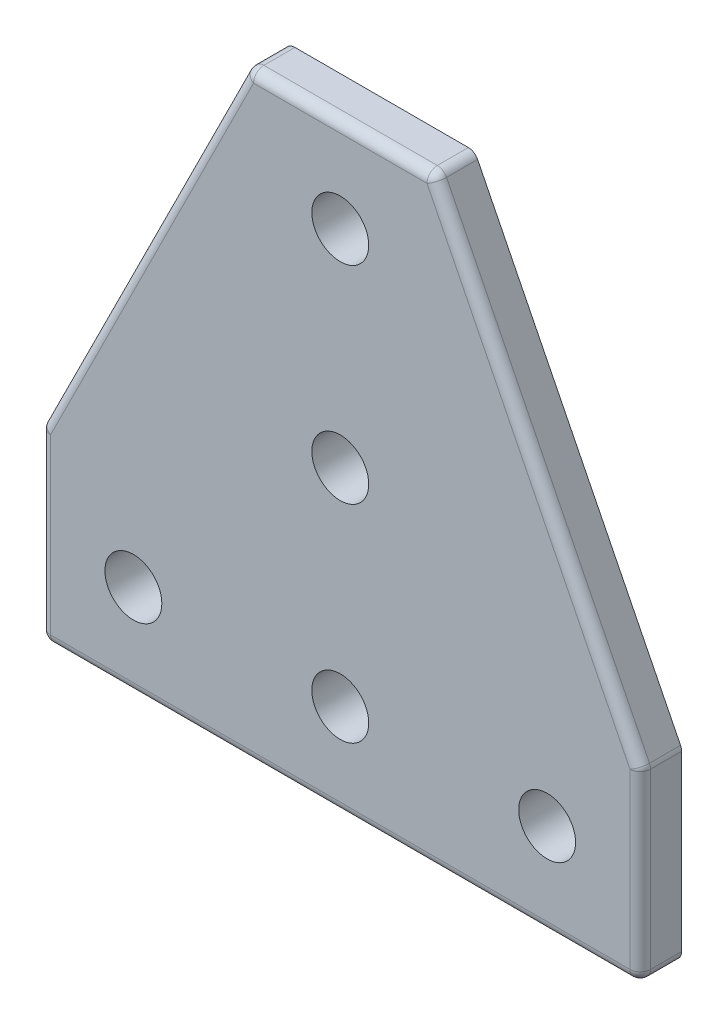
ISO-10303-21;
HEADER;
FILE_DESCRIPTION(('STEP AP214'),'2;1');
FILE_NAME('part.step','',(''),(''),'','','');
FILE_SCHEMA(('AUTOMOTIVE_DESIGN { 1 0 10303 214 1 1 1 1 }'));
ENDSEC;
DATA;
#1=APPLICATION_CONTEXT('core data for automotive mechanical design processes');
#2=APPLICATION_PROTOCOL_DEFINITION('international standard','automotive_design',2000,#1);
#3=PRODUCT_CONTEXT('',#1,'mechanical');
#4=PRODUCT('Part','Part','',(#3));
#5=PRODUCT_RELATED_PRODUCT_CATEGORY('part','',(#4));
#6=PRODUCT_DEFINITION_FORMATION('','',#4);
#7=PRODUCT_DEFINITION_CONTEXT('part definition',#1,'design');
#8=PRODUCT_DEFINITION('design','',#6,#7);
#9=PRODUCT_DEFINITION_SHAPE('','',#8);
#10=(LENGTH_UNIT() NAMED_UNIT(*) SI_UNIT(.MILLI.,.METRE.));
#11=(NAMED_UNIT(*) PLANE_ANGLE_UNIT() SI_UNIT($,.RADIAN.));
#12=(NAMED_UNIT(*) SI_UNIT($,.STERADIAN.) SOLID_ANGLE_UNIT());
#13=UNCERTAINTY_MEASURE_WITH_UNIT(LENGTH_MEASURE(1.E-05),#10,'distance_accuracy_value','');
#14=(GEOMETRIC_REPRESENTATION_CONTEXT(3) GLOBAL_UNCERTAINTY_ASSIGNED_CONTEXT((#13)) GLOBAL_UNIT_ASSIGNED_CONTEXT((#10,
#11,#12)) REPRESENTATION_CONTEXT('',''));
#15=CARTESIAN_POINT('',(0.,0.,0.));
#16=DIRECTION('',(0.,0.,1.));
#17=DIRECTION('',(1.,0.,0.));
#18=AXIS2_PLACEMENT_3D('',#15,#16,#17);
#19=CARTESIAN_POINT('',(0.,0.,2.));
#20=DIRECTION('',(0.,0.,-1.));
#21=DIRECTION('',(-1.,0.,0.));
#22=AXIS2_PLACEMENT_3D('',#19,#20,#21);
#23=PLANE('',#22);
#24=DIRECTION('',(-0.447213595499958,-0.894427190999916,0.));
#25=VECTOR('',#24,1.);
#26=CARTESIAN_POINT('',(-6.30557280900007,3.15278640450004,2.));
#27=LINE('',#26,#25);
#28=CARTESIAN_POINT('',(20.6180339887499,57.,2.));
#29=VERTEX_POINT('',#28);
#30=CARTESIAN_POINT('',(0.999999999999998,17.7639320225002,2.));
#31=VERTEX_POINT('',#30);
#32=EDGE_CURVE('E151',#29,#31,#27,.T.);
#33=ORIENTED_EDGE('',*,*,#32,.T.);
#34=DIRECTION('',(0.,-1.,0.));
#35=VECTOR('',#34,1.);
#36=CARTESIAN_POINT('',(1.,0.,2.));
#37=LINE('',#36,#35);
#38=CARTESIAN_POINT('',(1.,1.,2.));
#39=VERTEX_POINT('',#38);
#40=EDGE_CURVE('E188',#31,#39,#37,.T.);
#41=ORIENTED_EDGE('',*,*,#40,.T.);
#42=DIRECTION('',(1.,0.,0.));
#43=VECTOR('',#42,1.);
#44=CARTESIAN_POINT('',(0.,1.,2.));
#45=LINE('',#44,#43);
#46=CARTESIAN_POINT('',(57.,1.,2.));
#47=VERTEX_POINT('',#46);
#48=EDGE_CURVE('E186',#39,#47,#45,.T.);
#49=ORIENTED_EDGE('',*,*,#48,.T.);
#50=DIRECTION('',(0.,1.,0.));
#51=VECTOR('',#50,1.);
#52=CARTESIAN_POINT('',(57.,0.,2.));
#53=LINE('',#52,#51);
#54=CARTESIAN_POINT('',(57.,17.7639320225002,2.));
#55=VERTEX_POINT('',#54);
#56=EDGE_CURVE('E147',#47,#55,#53,.T.);
#57=ORIENTED_EDGE('',*,*,#56,.T.);
#58=DIRECTION('',(-0.447213595499958,0.894427190999916,0.));
#59=VECTOR('',#58,1.);
#60=CARTESIAN_POINT('',(52.7055728090001,26.3527864045,2.));
#61=LINE('',#60,#59);
#62=CARTESIAN_POINT('',(37.3819660112501,57.,2.));
#63=VERTEX_POINT('',#62);
#64=EDGE_CURVE('E139',#55,#63,#61,.T.);
#65=ORIENTED_EDGE('',*,*,#64,.T.);
#66=DIRECTION('',(-1.,0.,0.));
#67=VECTOR('',#66,1.);
#68=CARTESIAN_POINT('',(0.,57.,2.));
#69=LINE('',#68,#67);
#70=EDGE_CURVE('E144',#63,#29,#69,.T.);
#71=ORIENTED_EDGE('',*,*,#70,.T.);
#72=EDGE_LOOP('',(#33,#41,#49,#57,#65,#71));
#73=FACE_BOUND('',#72,.T.);
#74=CARTESIAN_POINT('',(29.,29.,2.));
#75=DIRECTION('',(0.,0.,1.));
#76=DIRECTION('',(1.,0.,0.));
#77=AXIS2_PLACEMENT_3D('',#74,#75,#76);
#78=CIRCLE('',#77,2.75000000000001);
#79=CARTESIAN_POINT('',(31.75,29.,2.));
#80=VERTEX_POINT('',#79);
#81=EDGE_CURVE('E281',#80,#80,#78,.T.);
#82=ORIENTED_EDGE('',*,*,#81,.F.);
#83=EDGE_LOOP('',(#82));
#84=FACE_BOUND('',#83,.T.);
#85=CARTESIAN_POINT('',(29.,8.99999999999999,2.));
#86=DIRECTION('',(0.,0.,1.));
#87=DIRECTION('',(1.,0.,0.));
#88=AXIS2_PLACEMENT_3D('',#85,#86,#87);
#89=CIRCLE('',#88,2.75);
#90=CARTESIAN_POINT('',(31.75,8.99999999999999,2.));
#91=VERTEX_POINT('',#90);
#92=EDGE_CURVE('E293',#91,#91,#89,.T.);
#93=ORIENTED_EDGE('',*,*,#92,.F.);
#94=EDGE_LOOP('',(#93));
#95=FACE_BOUND('',#94,.T.);
#96=CARTESIAN_POINT('',(9.,8.99999999999999,2.));
#97=DIRECTION('',(0.,0.,1.));
#98=DIRECTION('',(1.,0.,0.));
#99=AXIS2_PLACEMENT_3D('',#96,#97,#98);
#100=CIRCLE('',#99,2.75);
#101=CARTESIAN_POINT('',(11.75,8.99999999999999,2.));
#102=VERTEX_POINT('',#101);
#103=EDGE_CURVE('E299',#102,#102,#100,.T.);
#104=ORIENTED_EDGE('',*,*,#103,.F.);
#105=EDGE_LOOP('',(#104));
#106=FACE_BOUND('',#105,.T.);
#107=CARTESIAN_POINT('',(49.,8.99999999999999,2.));
#108=DIRECTION('',(0.,0.,1.));
#109=DIRECTION('',(1.,0.,0.));
#110=AXIS2_PLACEMENT_3D('',#107,#108,#109);
#111=CIRCLE('',#110,2.75000000000001);
#112=CARTESIAN_POINT('',(51.75,8.99999999999999,2.));
#113=VERTEX_POINT('',#112);
#114=EDGE_CURVE('E287',#113,#113,#111,.T.);
#115=ORIENTED_EDGE('',*,*,#114,.F.);
#116=EDGE_LOOP('',(#115));
#117=FACE_BOUND('',#116,.T.);
#118=CARTESIAN_POINT('',(29.,49.,2.));
#119=DIRECTION('',(0.,0.,1.));
#120=DIRECTION('',(1.,0.,0.));
#121=AXIS2_PLACEMENT_3D('',#118,#119,#120);
#122=CIRCLE('',#121,2.75);
#123=CARTESIAN_POINT('',(31.75,49.,2.));
#124=VERTEX_POINT('',#123);
#125=EDGE_CURVE('E273',#124,#124,#122,.T.);
#126=ORIENTED_EDGE('',*,*,#125,.F.);
#127=EDGE_LOOP('',(#126));
#128=FACE_BOUND('',#127,.T.);
#129=ADVANCED_FACE('F33',(#73,#84,#95,#106,#117,#128),#23,.F.);
#130=CARTESIAN_POINT('',(0.,0.,-2.));
#131=DIRECTION('',(0.,0.,-1.));
#132=DIRECTION('',(-1.,0.,0.));
#133=AXIS2_PLACEMENT_3D('',#130,#131,#132);
#134=PLANE('',#133);
#135=CARTESIAN_POINT('',(29.,29.,-2.));
#136=DIRECTION('',(0.,0.,1.));
#137=DIRECTION('',(1.,0.,0.));
#138=AXIS2_PLACEMENT_3D('',#135,#136,#137);
#139=CIRCLE('',#138,2.75000000000001);
#140=CARTESIAN_POINT('',(31.75,29.,-2.));
#141=VERTEX_POINT('',#140);
#142=EDGE_CURVE('E278',#141,#141,#139,.T.);
#143=ORIENTED_EDGE('',*,*,#142,.T.);
#144=EDGE_LOOP('',(#143));
#145=FACE_BOUND('',#144,.T.);
#146=CARTESIAN_POINT('',(29.,8.99999999999999,-2.));
#147=DIRECTION('',(0.,0.,1.));
#148=DIRECTION('',(1.,0.,0.));
#149=AXIS2_PLACEMENT_3D('',#146,#147,#148);
#150=CIRCLE('',#149,2.75);
#151=CARTESIAN_POINT('',(31.75,8.99999999999999,-2.));
#152=VERTEX_POINT('',#151);
#153=EDGE_CURVE('E290',#152,#152,#150,.T.);
#154=ORIENTED_EDGE('',*,*,#153,.T.);
#155=EDGE_LOOP('',(#154));
#156=FACE_BOUND('',#155,.T.);
#157=DIRECTION('',(-0.447213595499958,-0.894427190999916,0.));
#158=VECTOR('',#157,1.);
#159=CARTESIAN_POINT('',(0.,18.,-2.));
#160=LINE('',#159,#158);
#161=CARTESIAN_POINT('',(19.72360679775,57.4472135955,-2.));
#162=VERTEX_POINT('',#161);
#163=CARTESIAN_POINT('',(0.105572809000083,18.2111456180001,-2.));
#164=VERTEX_POINT('',#163);
#165=EDGE_CURVE('E180',#162,#164,#160,.T.);
#166=ORIENTED_EDGE('',*,*,#165,.F.);
#167=CARTESIAN_POINT('',(20.6180339887499,57.,-2.));
#168=DIRECTION('',(0.,0.,-1.));
#169=DIRECTION('',(-1.,0.,0.));
#170=AXIS2_PLACEMENT_3D('',#167,#168,#169);
#171=CIRCLE('',#170,1.);
#172=CARTESIAN_POINT('',(20.6180339887499,58.,-2.));
#173=VERTEX_POINT('',#172);
#174=EDGE_CURVE('E207',#162,#173,#171,.T.);
#175=ORIENTED_EDGE('',*,*,#174,.T.);
#176=DIRECTION('',(-1.,0.,0.));
#177=VECTOR('',#176,1.);
#178=CARTESIAN_POINT('',(38.,58.,-2.));
#179=LINE('',#178,#177);
#180=CARTESIAN_POINT('',(37.3819660112501,58.,-2.));
#181=VERTEX_POINT('',#180);
#182=EDGE_CURVE('E312',#181,#173,#179,.T.);
#183=ORIENTED_EDGE('',*,*,#182,.F.);
#184=CARTESIAN_POINT('',(37.3819660112501,57.,-2.));
#185=DIRECTION('',(0.,0.,-1.));
#186=DIRECTION('',(-1.,0.,0.));
#187=AXIS2_PLACEMENT_3D('',#184,#185,#186);
#188=CIRCLE('',#187,1.);
#189=CARTESIAN_POINT('',(38.27639320225,57.4472135955,-2.));
#190=VERTEX_POINT('',#189);
#191=EDGE_CURVE('E201',#181,#190,#188,.T.);
#192=ORIENTED_EDGE('',*,*,#191,.T.);
#193=DIRECTION('',(-0.447213595499958,0.894427190999916,0.));
#194=VECTOR('',#193,1.);
#195=CARTESIAN_POINT('',(38.,58.,-2.));
#196=LINE('',#195,#194);
#197=CARTESIAN_POINT('',(57.8944271909999,18.2111456180002,-2.));
#198=VERTEX_POINT('',#197);
#199=EDGE_CURVE('E309',#198,#190,#196,.T.);
#200=ORIENTED_EDGE('',*,*,#199,.F.);
#201=CARTESIAN_POINT('',(57.,17.7639320225002,-2.));
#202=DIRECTION('',(0.,0.,-1.));
#203=DIRECTION('',(-1.,0.,0.));
#204=AXIS2_PLACEMENT_3D('',#201,#202,#203);
#205=CIRCLE('',#204,1.);
#206=CARTESIAN_POINT('',(58.,17.7639320225002,-2.));
#207=VERTEX_POINT('',#206);
#208=EDGE_CURVE('E203',#198,#207,#205,.T.);
#209=ORIENTED_EDGE('',*,*,#208,.T.);
#210=DIRECTION('',(0.,1.,0.));
#211=VECTOR('',#210,1.);
#212=CARTESIAN_POINT('',(58.,18.,-2.));
#213=LINE('',#212,#211);
#214=CARTESIAN_POINT('',(58.,1.,-2.));
#215=VERTEX_POINT('',#214);
#216=EDGE_CURVE('E306',#215,#207,#213,.T.);
#217=ORIENTED_EDGE('',*,*,#216,.F.);
#218=CARTESIAN_POINT('',(57.,1.,-2.));
#219=DIRECTION('',(0.,0.,-1.));
#220=DIRECTION('',(-1.,0.,0.));
#221=AXIS2_PLACEMENT_3D('',#218,#219,#220);
#222=CIRCLE('',#221,1.);
#223=CARTESIAN_POINT('',(57.,0.,-2.));
#224=VERTEX_POINT('',#223);
#225=EDGE_CURVE('E197',#215,#224,#222,.T.);
#226=ORIENTED_EDGE('',*,*,#225,.T.);
#227=DIRECTION('',(1.,0.,0.));
#228=VECTOR('',#227,1.);
#229=CARTESIAN_POINT('',(58.,0.,-2.));
#230=LINE('',#229,#228);
#231=CARTESIAN_POINT('',(1.00000000000001,0.,-2.));
#232=VERTEX_POINT('',#231);
#233=EDGE_CURVE('E302',#232,#224,#230,.T.);
#234=ORIENTED_EDGE('',*,*,#233,.F.);
#235=CARTESIAN_POINT('',(1.,1.,-2.));
#236=DIRECTION('',(0.,0.,-1.));
#237=DIRECTION('',(-1.,0.,0.));
#238=AXIS2_PLACEMENT_3D('',#235,#236,#237);
#239=CIRCLE('',#238,1.);
#240=CARTESIAN_POINT('',(0.,1.,-2.));
#241=VERTEX_POINT('',#240);
#242=EDGE_CURVE('E199',#232,#241,#239,.T.);
#243=ORIENTED_EDGE('',*,*,#242,.T.);
#244=DIRECTION('',(0.,-1.,0.));
#245=VECTOR('',#244,1.);
#246=CARTESIAN_POINT('',(0.,0.,-2.));
#247=LINE('',#246,#245);
#248=CARTESIAN_POINT('',(0.,17.7639320225002,-2.));
#249=VERTEX_POINT('',#248);
#250=EDGE_CURVE('E177',#249,#241,#247,.T.);
#251=ORIENTED_EDGE('',*,*,#250,.F.);
#252=CARTESIAN_POINT('',(0.999999999999998,17.7639320225002,-2.));
#253=DIRECTION('',(0.,0.,-1.));
#254=DIRECTION('',(-1.,0.,0.));
#255=AXIS2_PLACEMENT_3D('',#252,#253,#254);
#256=CIRCLE('',#255,1.);
#257=EDGE_CURVE('E205',#249,#164,#256,.T.);
#258=ORIENTED_EDGE('',*,*,#257,.T.);
#259=EDGE_LOOP('',(#166,#175,#183,#192,#200,#209,#217,#226,#234,#243,#251,#258));
#260=FACE_BOUND('',#259,.T.);
#261=CARTESIAN_POINT('',(9.,8.99999999999999,-2.));
#262=DIRECTION('',(0.,0.,1.));
#263=DIRECTION('',(1.,0.,0.));
#264=AXIS2_PLACEMENT_3D('',#261,#262,#263);
#265=CIRCLE('',#264,2.75);
#266=CARTESIAN_POINT('',(11.75,8.99999999999999,-2.));
#267=VERTEX_POINT('',#266);
#268=EDGE_CURVE('E296',#267,#267,#265,.T.);
#269=ORIENTED_EDGE('',*,*,#268,.T.);
#270=EDGE_LOOP('',(#269));
#271=FACE_BOUND('',#270,.T.);
#272=CARTESIAN_POINT('',(49.,8.99999999999999,-2.));
#273=DIRECTION('',(0.,0.,1.));
#274=DIRECTION('',(1.,0.,0.));
#275=AXIS2_PLACEMENT_3D('',#272,#273,#274);
#276=CIRCLE('',#275,2.75000000000001);
#277=CARTESIAN_POINT('',(51.75,8.99999999999999,-2.));
#278=VERTEX_POINT('',#277);
#279=EDGE_CURVE('E284',#278,#278,#276,.T.);
#280=ORIENTED_EDGE('',*,*,#279,.T.);
#281=EDGE_LOOP('',(#280));
#282=FACE_BOUND('',#281,.T.);
#283=CARTESIAN_POINT('',(29.,49.,-2.));
#284=DIRECTION('',(0.,0.,1.));
#285=DIRECTION('',(1.,0.,0.));
#286=AXIS2_PLACEMENT_3D('',#283,#284,#285);
#287=CIRCLE('',#286,2.75);
#288=CARTESIAN_POINT('',(31.75,49.,-2.));
#289=VERTEX_POINT('',#288);
#290=EDGE_CURVE('E270',#289,#289,#287,.T.);
#291=ORIENTED_EDGE('',*,*,#290,.T.);
#292=EDGE_LOOP('',(#291));
#293=FACE_BOUND('',#292,.T.);
#294=ADVANCED_FACE('F354',(#145,#156,#260,#271,#282,#293),#134,.T.);
#295=CARTESIAN_POINT('',(58.,0.,2.));
#296=DIRECTION('',(0.,1.,0.));
#297=DIRECTION('',(-1.,0.,0.));
#298=AXIS2_PLACEMENT_3D('',#295,#296,#297);
#299=PLANE('',#298);
#300=DIRECTION('',(1.,0.,0.));
#301=VECTOR('',#300,1.);
#302=CARTESIAN_POINT('',(58.,0.,1.));
#303=LINE('',#302,#301);
#304=CARTESIAN_POINT('',(57.,0.,1.));
#305=VERTEX_POINT('',#304);
#306=CARTESIAN_POINT('',(1.,0.,1.));
#307=VERTEX_POINT('',#306);
#308=EDGE_CURVE('E42',#305,#307,#303,.F.);
#309=ORIENTED_EDGE('',*,*,#308,.T.);
#310=DIRECTION('',(0.,0.,-1.));
#311=VECTOR('',#310,1.);
#312=CARTESIAN_POINT('',(1.,0.,2.));
#313=LINE('',#312,#311);
#314=EDGE_CURVE('E11',#307,#232,#313,.T.);
#315=ORIENTED_EDGE('',*,*,#314,.T.);
#316=ORIENTED_EDGE('',*,*,#233,.T.);
#317=DIRECTION('',(0.,0.,-1.));
#318=VECTOR('',#317,1.);
#319=CARTESIAN_POINT('',(57.,0.,2.));
#320=LINE('',#319,#318);
#321=EDGE_CURVE('E53',#224,#305,#320,.F.);
#322=ORIENTED_EDGE('',*,*,#321,.T.);
#323=EDGE_LOOP('',(#309,#315,#316,#322));
#324=FACE_BOUND('',#323,.T.);
#325=ADVANCED_FACE('F353',(#324),#299,.F.);
#326=CARTESIAN_POINT('',(58.,18.,2.));
#327=DIRECTION('',(-1.,0.,0.));
#328=DIRECTION('',(0.,0.,1.));
#329=AXIS2_PLACEMENT_3D('',#326,#327,#328);
#330=PLANE('',#329);
#331=ORIENTED_EDGE('',*,*,#216,.T.);
#332=DIRECTION('',(0.,0.,-1.));
#333=VECTOR('',#332,1.);
#334=CARTESIAN_POINT('',(58.,17.7639320225002,2.));
#335=LINE('',#334,#333);
#336=CARTESIAN_POINT('',(58.,17.7639320225002,1.));
#337=VERTEX_POINT('',#336);
#338=EDGE_CURVE('E230',#207,#337,#335,.F.);
#339=ORIENTED_EDGE('',*,*,#338,.T.);
#340=DIRECTION('',(0.,1.,0.));
#341=VECTOR('',#340,1.);
#342=CARTESIAN_POINT('',(58.,18.,1.));
#343=LINE('',#342,#341);
#344=CARTESIAN_POINT('',(58.,1.,1.));
#345=VERTEX_POINT('',#344);
#346=EDGE_CURVE('E228',#337,#345,#343,.F.);
#347=ORIENTED_EDGE('',*,*,#346,.T.);
#348=DIRECTION('',(0.,0.,-1.));
#349=VECTOR('',#348,1.);
#350=CARTESIAN_POINT('',(58.,1.,2.));
#351=LINE('',#350,#349);
#352=EDGE_CURVE('E226',#345,#215,#351,.T.);
#353=ORIENTED_EDGE('',*,*,#352,.T.);
#354=EDGE_LOOP('',(#331,#339,#347,#353));
#355=FACE_BOUND('',#354,.T.);
#356=ADVANCED_FACE('F402',(#355),#330,.F.);
#357=CARTESIAN_POINT('',(38.,58.,2.));
#358=DIRECTION('',(-0.894427190999916,-0.447213595499958,0.));
#359=DIRECTION('',(0.447213595499958,-0.894427190999916,0.));
#360=AXIS2_PLACEMENT_3D('',#357,#358,#359);
#361=PLANE('',#360);
#362=DIRECTION('',(-0.447213595499958,0.894427190999916,0.));
#363=VECTOR('',#362,1.);
#364=CARTESIAN_POINT('',(38.,58.,1.));
#365=LINE('',#364,#363);
#366=CARTESIAN_POINT('',(38.27639320225,57.4472135955,1.));
#367=VERTEX_POINT('',#366);
#368=CARTESIAN_POINT('',(57.8944271909999,18.2111456180002,1.));
#369=VERTEX_POINT('',#368);
#370=EDGE_CURVE('E158',#367,#369,#365,.F.);
#371=ORIENTED_EDGE('',*,*,#370,.T.);
#372=DIRECTION('',(0.,0.,-1.));
#373=VECTOR('',#372,1.);
#374=CARTESIAN_POINT('',(57.8944271909999,18.2111456180002,2.));
#375=LINE('',#374,#373);
#376=EDGE_CURVE('E224',#369,#198,#375,.T.);
#377=ORIENTED_EDGE('',*,*,#376,.T.);
#378=ORIENTED_EDGE('',*,*,#199,.T.);
#379=DIRECTION('',(0.,0.,-1.));
#380=VECTOR('',#379,1.);
#381=CARTESIAN_POINT('',(38.27639320225,57.4472135955,2.));
#382=LINE('',#381,#380);
#383=EDGE_CURVE('E221',#190,#367,#382,.F.);
#384=ORIENTED_EDGE('',*,*,#383,.T.);
#385=EDGE_LOOP('',(#371,#377,#378,#384));
#386=FACE_BOUND('',#385,.T.);
#387=ADVANCED_FACE('F398',(#386),#361,.F.);
#388=CARTESIAN_POINT('',(38.,58.,2.));
#389=DIRECTION('',(0.,-1.,0.));
#390=DIRECTION('',(0.,0.,-1.));
#391=AXIS2_PLACEMENT_3D('',#388,#389,#390);
#392=PLANE('',#391);
#393=ORIENTED_EDGE('',*,*,#182,.T.);
#394=DIRECTION('',(0.,0.,-1.));
#395=VECTOR('',#394,1.);
#396=CARTESIAN_POINT('',(20.6180339887499,58.,2.));
#397=LINE('',#396,#395);
#398=CARTESIAN_POINT('',(20.6180339887499,58.,1.));
#399=VERTEX_POINT('',#398);
#400=EDGE_CURVE('E213',#173,#399,#397,.F.);
#401=ORIENTED_EDGE('',*,*,#400,.T.);
#402=DIRECTION('',(-1.,0.,0.));
#403=VECTOR('',#402,1.);
#404=CARTESIAN_POINT('',(38.,58.,1.));
#405=LINE('',#404,#403);
#406=CARTESIAN_POINT('',(37.3819660112501,58.,1.));
#407=VERTEX_POINT('',#406);
#408=EDGE_CURVE('E209',#399,#407,#405,.F.);
#409=ORIENTED_EDGE('',*,*,#408,.T.);
#410=DIRECTION('',(0.,0.,-1.));
#411=VECTOR('',#410,1.);
#412=CARTESIAN_POINT('',(37.3819660112501,58.,2.));
#413=LINE('',#412,#411);
#414=EDGE_CURVE('E211',#407,#181,#413,.T.);
#415=ORIENTED_EDGE('',*,*,#414,.T.);
#416=EDGE_LOOP('',(#393,#401,#409,#415));
#417=FACE_BOUND('',#416,.T.);
#418=ADVANCED_FACE('F395',(#417),#392,.F.);
#419=CARTESIAN_POINT('',(0.,18.,2.));
#420=DIRECTION('',(0.894427190999916,-0.447213595499958,0.));
#421=DIRECTION('',(0.447213595499958,0.894427190999916,0.));
#422=AXIS2_PLACEMENT_3D('',#419,#420,#421);
#423=PLANE('',#422);
#424=DIRECTION('',(-0.447213595499958,-0.894427190999916,0.));
#425=VECTOR('',#424,1.);
#426=CARTESIAN_POINT('',(0.,18.,1.));
#427=LINE('',#426,#425);
#428=CARTESIAN_POINT('',(0.105572809000083,18.2111456180001,1.));
#429=VERTEX_POINT('',#428);
#430=CARTESIAN_POINT('',(19.72360679775,57.4472135955,1.));
#431=VERTEX_POINT('',#430);
#432=EDGE_CURVE('E192',#429,#431,#427,.F.);
#433=ORIENTED_EDGE('',*,*,#432,.T.);
#434=DIRECTION('',(0.,0.,-1.));
#435=VECTOR('',#434,1.);
#436=CARTESIAN_POINT('',(19.72360679775,57.4472135955,2.));
#437=LINE('',#436,#435);
#438=EDGE_CURVE('E195',#431,#162,#437,.T.);
#439=ORIENTED_EDGE('',*,*,#438,.T.);
#440=ORIENTED_EDGE('',*,*,#165,.T.);
#441=DIRECTION('',(0.,0.,-1.));
#442=VECTOR('',#441,1.);
#443=CARTESIAN_POINT('',(0.105572809000083,18.2111456180001,2.));
#444=LINE('',#443,#442);
#445=EDGE_CURVE('E190',#164,#429,#444,.F.);
#446=ORIENTED_EDGE('',*,*,#445,.T.);
#447=EDGE_LOOP('',(#433,#439,#440,#446));
#448=FACE_BOUND('',#447,.T.);
#449=ADVANCED_FACE('F318',(#448),#423,.F.);
#450=CARTESIAN_POINT('',(0.,0.,2.));
#451=DIRECTION('',(1.,0.,0.));
#452=DIRECTION('',(0.,1.,0.));
#453=AXIS2_PLACEMENT_3D('',#450,#451,#452);
#454=PLANE('',#453);
#455=DIRECTION('',(0.,-1.,0.));
#456=VECTOR('',#455,1.);
#457=CARTESIAN_POINT('',(0.,0.,1.));
#458=LINE('',#457,#456);
#459=CARTESIAN_POINT('',(0.,1.,1.));
#460=VERTEX_POINT('',#459);
#461=CARTESIAN_POINT('',(0.,17.7639320225002,1.));
#462=VERTEX_POINT('',#461);
#463=EDGE_CURVE('E215',#460,#462,#458,.F.);
#464=ORIENTED_EDGE('',*,*,#463,.T.);
#465=DIRECTION('',(0.,0.,-1.));
#466=VECTOR('',#465,1.);
#467=CARTESIAN_POINT('',(0.,17.7639320225002,2.));
#468=LINE('',#467,#466);
#469=EDGE_CURVE('E219',#462,#249,#468,.T.);
#470=ORIENTED_EDGE('',*,*,#469,.T.);
#471=ORIENTED_EDGE('',*,*,#250,.T.);
#472=DIRECTION('',(0.,0.,-1.));
#473=VECTOR('',#472,1.);
#474=CARTESIAN_POINT('',(0.,1.,2.));
#475=LINE('',#474,#473);
#476=EDGE_CURVE('E217',#241,#460,#475,.F.);
#477=ORIENTED_EDGE('',*,*,#476,.T.);
#478=EDGE_LOOP('',(#464,#470,#471,#477));
#479=FACE_BOUND('',#478,.T.);
#480=ADVANCED_FACE('F389',(#479),#454,.F.);
#481=CARTESIAN_POINT('',(9.,8.99999999999999,2.));
#482=DIRECTION('',(0.,0.,-1.));
#483=DIRECTION('',(-1.,0.,0.));
#484=AXIS2_PLACEMENT_3D('',#481,#482,#483);
#485=CYLINDRICAL_SURFACE('',#484,2.75);
#486=ORIENTED_EDGE('',*,*,#103,.T.);
#487=EDGE_LOOP('',(#486));
#488=FACE_BOUND('',#487,.T.);
#489=ORIENTED_EDGE('',*,*,#268,.F.);
#490=EDGE_LOOP('',(#489));
#491=FACE_BOUND('',#490,.T.);
#492=ADVANCED_FACE('F386',(#488,#491),#485,.F.);
#493=CARTESIAN_POINT('',(29.,8.99999999999999,2.));
#494=DIRECTION('',(0.,0.,-1.));
#495=DIRECTION('',(-1.,0.,0.));
#496=AXIS2_PLACEMENT_3D('',#493,#494,#495);
#497=CYLINDRICAL_SURFACE('',#496,2.75);
#498=ORIENTED_EDGE('',*,*,#92,.T.);
#499=EDGE_LOOP('',(#498));
#500=FACE_BOUND('',#499,.T.);
#501=ORIENTED_EDGE('',*,*,#153,.F.);
#502=EDGE_LOOP('',(#501));
#503=FACE_BOUND('',#502,.T.);
#504=ADVANCED_FACE('F468',(#500,#503),#497,.F.);
#505=CARTESIAN_POINT('',(49.,8.99999999999999,2.));
#506=DIRECTION('',(0.,0.,-1.));
#507=DIRECTION('',(-1.,0.,0.));
#508=AXIS2_PLACEMENT_3D('',#505,#506,#507);
#509=CYLINDRICAL_SURFACE('',#508,2.75000000000001);
#510=ORIENTED_EDGE('',*,*,#114,.T.);
#511=EDGE_LOOP('',(#510));
#512=FACE_BOUND('',#511,.T.);
#513=ORIENTED_EDGE('',*,*,#279,.F.);
#514=EDGE_LOOP('',(#513));
#515=FACE_BOUND('',#514,.T.);
#516=ADVANCED_FACE('F462',(#512,#515),#509,.F.);
#517=CARTESIAN_POINT('',(29.,29.,2.));
#518=DIRECTION('',(0.,0.,-1.));
#519=DIRECTION('',(-1.,0.,0.));
#520=AXIS2_PLACEMENT_3D('',#517,#518,#519);
#521=CYLINDRICAL_SURFACE('',#520,2.75000000000001);
#522=ORIENTED_EDGE('',*,*,#81,.T.);
#523=EDGE_LOOP('',(#522));
#524=FACE_BOUND('',#523,.T.);
#525=ORIENTED_EDGE('',*,*,#142,.F.);
#526=EDGE_LOOP('',(#525));
#527=FACE_BOUND('',#526,.T.);
#528=ADVANCED_FACE('F456',(#524,#527),#521,.F.);
#529=CARTESIAN_POINT('',(29.,49.,2.));
#530=DIRECTION('',(0.,0.,-1.));
#531=DIRECTION('',(-1.,0.,0.));
#532=AXIS2_PLACEMENT_3D('',#529,#530,#531);
#533=CYLINDRICAL_SURFACE('',#532,2.75);
#534=ORIENTED_EDGE('',*,*,#125,.T.);
#535=EDGE_LOOP('',(#534));
#536=FACE_BOUND('',#535,.T.);
#537=ORIENTED_EDGE('',*,*,#290,.F.);
#538=EDGE_LOOP('',(#537));
#539=FACE_BOUND('',#538,.T.);
#540=ADVANCED_FACE('F451',(#536,#539),#533,.F.);
#541=CARTESIAN_POINT('',(57.,17.7639320225002,2.));
#542=DIRECTION('',(0.,0.,-1.));
#543=DIRECTION('',(-1.,0.,0.));
#544=AXIS2_PLACEMENT_3D('',#541,#542,#543);
#545=CYLINDRICAL_SURFACE('',#544,1.);
#546=ORIENTED_EDGE('',*,*,#208,.F.);
#547=ORIENTED_EDGE('',*,*,#376,.F.);
#548=CARTESIAN_POINT('',(57.,17.7639320225002,1.));
#549=DIRECTION('',(0.,0.,1.));
#550=DIRECTION('',(1.,0.,0.));
#551=AXIS2_PLACEMENT_3D('',#548,#549,#550);
#552=CIRCLE('',#551,1.);
#553=EDGE_CURVE('E37',#337,#369,#552,.T.);
#554=ORIENTED_EDGE('',*,*,#553,.F.);
#555=ORIENTED_EDGE('',*,*,#338,.F.);
#556=EDGE_LOOP('',(#546,#547,#554,#555));
#557=FACE_BOUND('',#556,.T.);
#558=ADVANCED_FACE('F35',(#557),#545,.T.);
#559=CARTESIAN_POINT('',(57.,0.,1.));
#560=DIRECTION('',(0.,1.,0.));
#561=DIRECTION('',(0.,0.,1.));
#562=AXIS2_PLACEMENT_3D('',#559,#560,#561);
#563=CYLINDRICAL_SURFACE('',#562,1.);
#564=CARTESIAN_POINT('',(57.,1.,1.));
#565=DIRECTION('',(0.,-1.,0.));
#566=DIRECTION('',(0.,0.,-1.));
#567=AXIS2_PLACEMENT_3D('',#564,#565,#566);
#568=CIRCLE('',#567,1.);
#569=EDGE_CURVE('E263',#345,#47,#568,.T.);
#570=ORIENTED_EDGE('',*,*,#569,.F.);
#571=ORIENTED_EDGE('',*,*,#346,.F.);
#572=CARTESIAN_POINT('',(57.,17.7639320225002,1.));
#573=DIRECTION('',(0.,1.,0.));
#574=DIRECTION('',(0.,0.,1.));
#575=AXIS2_PLACEMENT_3D('',#572,#573,#574);
#576=CIRCLE('',#575,1.);
#577=EDGE_CURVE('E265',#55,#337,#576,.T.);
#578=ORIENTED_EDGE('',*,*,#577,.F.);
#579=ORIENTED_EDGE('',*,*,#56,.F.);
#580=EDGE_LOOP('',(#570,#571,#578,#579));
#581=FACE_BOUND('',#580,.T.);
#582=ADVANCED_FACE('F367',(#581),#563,.T.);
#583=CARTESIAN_POINT('',(57.,1.,2.));
#584=DIRECTION('',(0.,0.,-1.));
#585=DIRECTION('',(-1.,0.,0.));
#586=AXIS2_PLACEMENT_3D('',#583,#584,#585);
#587=CYLINDRICAL_SURFACE('',#586,1.);
#588=ORIENTED_EDGE('',*,*,#225,.F.);
#589=ORIENTED_EDGE('',*,*,#352,.F.);
#590=CARTESIAN_POINT('',(57.,1.,1.));
#591=DIRECTION('',(0.,0.,1.));
#592=DIRECTION('',(1.,0.,0.));
#593=AXIS2_PLACEMENT_3D('',#590,#591,#592);
#594=CIRCLE('',#593,1.);
#595=EDGE_CURVE('E260',#305,#345,#594,.T.);
#596=ORIENTED_EDGE('',*,*,#595,.F.);
#597=ORIENTED_EDGE('',*,*,#321,.F.);
#598=EDGE_LOOP('',(#588,#589,#596,#597));
#599=FACE_BOUND('',#598,.T.);
#600=ADVANCED_FACE('F361',(#599),#587,.T.);
#601=CARTESIAN_POINT('',(57.,17.7639320225002,1.));
#602=DIRECTION('',(0.,0.,1.));
#603=DIRECTION('',(1.,0.,0.));
#604=AXIS2_PLACEMENT_3D('',#601,#602,#603);
#605=SPHERICAL_SURFACE('',#604,1.);
#606=ORIENTED_EDGE('',*,*,#577,.T.);
#607=ORIENTED_EDGE('',*,*,#553,.T.);
#608=CARTESIAN_POINT('',(57.,17.7639320225002,1.));
#609=DIRECTION('',(0.447213595499958,-0.894427190999916,0.));
#610=DIRECTION('',(0.894427190999916,0.447213595499958,0.));
#611=AXIS2_PLACEMENT_3D('',#608,#609,#610);
#612=CIRCLE('',#611,1.);
#613=EDGE_CURVE('E258',#55,#369,#612,.F.);
#614=ORIENTED_EDGE('',*,*,#613,.F.);
#615=EDGE_LOOP('',(#606,#607,#614));
#616=FACE_BOUND('',#615,.T.);
#617=ADVANCED_FACE('F368',(#616),#605,.T.);
#618=CARTESIAN_POINT('',(57.,1.,1.));
#619=DIRECTION('',(0.,0.,1.));
#620=DIRECTION('',(1.,0.,0.));
#621=AXIS2_PLACEMENT_3D('',#618,#619,#620);
#622=SPHERICAL_SURFACE('',#621,1.);
#623=ORIENTED_EDGE('',*,*,#595,.T.);
#624=ORIENTED_EDGE('',*,*,#569,.T.);
#625=CARTESIAN_POINT('',(57.,1.,1.));
#626=DIRECTION('',(1.,0.,0.));
#627=DIRECTION('',(0.,0.,-1.));
#628=AXIS2_PLACEMENT_3D('',#625,#626,#627);
#629=CIRCLE('',#628,1.);
#630=EDGE_CURVE('E255',#305,#47,#629,.F.);
#631=ORIENTED_EDGE('',*,*,#630,.F.);
#632=EDGE_LOOP('',(#623,#624,#631));
#633=FACE_BOUND('',#632,.T.);
#634=ADVANCED_FACE('F364',(#633),#622,.T.);
#635=CARTESIAN_POINT('',(37.3819660112501,57.,2.));
#636=DIRECTION('',(0.,0.,-1.));
#637=DIRECTION('',(-1.,0.,0.));
#638=AXIS2_PLACEMENT_3D('',#635,#636,#637);
#639=CYLINDRICAL_SURFACE('',#638,1.);
#640=ORIENTED_EDGE('',*,*,#191,.F.);
#641=ORIENTED_EDGE('',*,*,#414,.F.);
#642=CARTESIAN_POINT('',(37.3819660112501,57.,1.));
#643=DIRECTION('',(0.,0.,1.));
#644=DIRECTION('',(1.,0.,0.));
#645=AXIS2_PLACEMENT_3D('',#642,#643,#644);
#646=CIRCLE('',#645,1.);
#647=EDGE_CURVE('E162',#367,#407,#646,.T.);
#648=ORIENTED_EDGE('',*,*,#647,.F.);
#649=ORIENTED_EDGE('',*,*,#383,.F.);
#650=EDGE_LOOP('',(#640,#641,#648,#649));
#651=FACE_BOUND('',#650,.T.);
#652=ADVANCED_FACE('F375',(#651),#639,.T.);
#653=CARTESIAN_POINT('',(52.7055728090001,26.3527864045,1.));
#654=DIRECTION('',(-0.447213595499958,0.894427190999916,0.));
#655=DIRECTION('',(-0.894427190999916,-0.447213595499958,0.));
#656=AXIS2_PLACEMENT_3D('',#653,#654,#655);
#657=CYLINDRICAL_SURFACE('',#656,1.);
#658=ORIENTED_EDGE('',*,*,#613,.T.);
#659=ORIENTED_EDGE('',*,*,#370,.F.);
#660=CARTESIAN_POINT('',(37.3819660112501,57.,1.));
#661=DIRECTION('',(-0.447213595499958,0.894427190999916,0.));
#662=DIRECTION('',(-0.894427190999916,-0.447213595499958,0.));
#663=AXIS2_PLACEMENT_3D('',#660,#661,#662);
#664=CIRCLE('',#663,1.);
#665=EDGE_CURVE('E155',#63,#367,#664,.T.);
#666=ORIENTED_EDGE('',*,*,#665,.F.);
#667=ORIENTED_EDGE('',*,*,#64,.F.);
#668=EDGE_LOOP('',(#658,#659,#666,#667));
#669=FACE_BOUND('',#668,.T.);
#670=ADVANCED_FACE('F157',(#669),#657,.T.);
#671=CARTESIAN_POINT('',(0.,1.,1.));
#672=DIRECTION('',(1.,0.,0.));
#673=DIRECTION('',(0.,1.,0.));
#674=AXIS2_PLACEMENT_3D('',#671,#672,#673);
#675=CYLINDRICAL_SURFACE('',#674,1.);
#676=ORIENTED_EDGE('',*,*,#630,.T.);
#677=ORIENTED_EDGE('',*,*,#48,.F.);
#678=CARTESIAN_POINT('',(1.,1.,1.));
#679=DIRECTION('',(-1.,0.,0.));
#680=DIRECTION('',(0.,0.,1.));
#681=AXIS2_PLACEMENT_3D('',#678,#679,#680);
#682=CIRCLE('',#681,1.);
#683=EDGE_CURVE('E163',#307,#39,#682,.T.);
#684=ORIENTED_EDGE('',*,*,#683,.F.);
#685=ORIENTED_EDGE('',*,*,#308,.F.);
#686=EDGE_LOOP('',(#676,#677,#684,#685));
#687=FACE_BOUND('',#686,.T.);
#688=ADVANCED_FACE('F343',(#687),#675,.T.);
#689=CARTESIAN_POINT('',(1.,1.,2.));
#690=DIRECTION('',(0.,0.,-1.));
#691=DIRECTION('',(-1.,0.,0.));
#692=AXIS2_PLACEMENT_3D('',#689,#690,#691);
#693=CYLINDRICAL_SURFACE('',#692,1.);
#694=ORIENTED_EDGE('',*,*,#242,.F.);
#695=ORIENTED_EDGE('',*,*,#314,.F.);
#696=CARTESIAN_POINT('',(1.,1.,1.));
#697=DIRECTION('',(0.,0.,1.));
#698=DIRECTION('',(1.,0.,0.));
#699=AXIS2_PLACEMENT_3D('',#696,#697,#698);
#700=CIRCLE('',#699,1.);
#701=EDGE_CURVE('E170',#460,#307,#700,.T.);
#702=ORIENTED_EDGE('',*,*,#701,.F.);
#703=ORIENTED_EDGE('',*,*,#476,.F.);
#704=EDGE_LOOP('',(#694,#695,#702,#703));
#705=FACE_BOUND('',#704,.T.);
#706=ADVANCED_FACE('F351',(#705),#693,.T.);
#707=CARTESIAN_POINT('',(37.3819660112501,57.,1.));
#708=DIRECTION('',(0.,0.,1.));
#709=DIRECTION('',(1.,0.,0.));
#710=AXIS2_PLACEMENT_3D('',#707,#708,#709);
#711=SPHERICAL_SURFACE('',#710,1.);
#712=ORIENTED_EDGE('',*,*,#665,.T.);
#713=ORIENTED_EDGE('',*,*,#647,.T.);
#714=CARTESIAN_POINT('',(37.3819660112501,57.,1.));
#715=DIRECTION('',(1.,0.,0.));
#716=DIRECTION('',(0.,0.,-1.));
#717=AXIS2_PLACEMENT_3D('',#714,#715,#716);
#718=CIRCLE('',#717,1.);
#719=EDGE_CURVE('E166',#63,#407,#718,.F.);
#720=ORIENTED_EDGE('',*,*,#719,.F.);
#721=EDGE_LOOP('',(#712,#713,#720));
#722=FACE_BOUND('',#721,.T.);
#723=ADVANCED_FACE('F167',(#722),#711,.T.);
#724=CARTESIAN_POINT('',(1.,1.,1.));
#725=DIRECTION('',(0.,0.,1.));
#726=DIRECTION('',(1.,0.,0.));
#727=AXIS2_PLACEMENT_3D('',#724,#725,#726);
#728=SPHERICAL_SURFACE('',#727,1.);
#729=ORIENTED_EDGE('',*,*,#701,.T.);
#730=ORIENTED_EDGE('',*,*,#683,.T.);
#731=CARTESIAN_POINT('',(1.,1.,1.));
#732=DIRECTION('',(0.,-1.,0.));
#733=DIRECTION('',(1.,0.,0.));
#734=AXIS2_PLACEMENT_3D('',#731,#732,#733);
#735=CIRCLE('',#734,1.);
#736=EDGE_CURVE('E171',#460,#39,#735,.F.);
#737=ORIENTED_EDGE('',*,*,#736,.F.);
#738=EDGE_LOOP('',(#729,#730,#737));
#739=FACE_BOUND('',#738,.T.);
#740=ADVANCED_FACE('F346',(#739),#728,.T.);
#741=CARTESIAN_POINT('',(20.6180339887499,57.,2.));
#742=DIRECTION('',(0.,0.,-1.));
#743=DIRECTION('',(-1.,0.,0.));
#744=AXIS2_PLACEMENT_3D('',#741,#742,#743);
#745=CYLINDRICAL_SURFACE('',#744,1.);
#746=ORIENTED_EDGE('',*,*,#174,.F.);
#747=ORIENTED_EDGE('',*,*,#438,.F.);
#748=CARTESIAN_POINT('',(20.6180339887499,57.,1.));
#749=DIRECTION('',(0.,0.,1.));
#750=DIRECTION('',(1.,0.,0.));
#751=AXIS2_PLACEMENT_3D('',#748,#749,#750);
#752=CIRCLE('',#751,1.);
#753=EDGE_CURVE('E245',#399,#431,#752,.T.);
#754=ORIENTED_EDGE('',*,*,#753,.F.);
#755=ORIENTED_EDGE('',*,*,#400,.F.);
#756=EDGE_LOOP('',(#746,#747,#754,#755));
#757=FACE_BOUND('',#756,.T.);
#758=ADVANCED_FACE('F423',(#757),#745,.T.);
#759=CARTESIAN_POINT('',(0.,57.,1.));
#760=DIRECTION('',(-1.,0.,0.));
#761=DIRECTION('',(0.,0.,1.));
#762=AXIS2_PLACEMENT_3D('',#759,#760,#761);
#763=CYLINDRICAL_SURFACE('',#762,1.);
#764=ORIENTED_EDGE('',*,*,#719,.T.);
#765=ORIENTED_EDGE('',*,*,#408,.F.);
#766=CARTESIAN_POINT('',(20.6180339887499,57.,1.));
#767=DIRECTION('',(-1.,0.,0.));
#768=DIRECTION('',(0.,0.,1.));
#769=AXIS2_PLACEMENT_3D('',#766,#767,#768);
#770=CIRCLE('',#769,1.);
#771=EDGE_CURVE('E175',#29,#399,#770,.T.);
#772=ORIENTED_EDGE('',*,*,#771,.F.);
#773=ORIENTED_EDGE('',*,*,#70,.F.);
#774=EDGE_LOOP('',(#764,#765,#772,#773));
#775=FACE_BOUND('',#774,.T.);
#776=ADVANCED_FACE('F173',(#775),#763,.T.);
#777=CARTESIAN_POINT('',(1.,0.,1.));
#778=DIRECTION('',(0.,-1.,0.));
#779=DIRECTION('',(1.,0.,0.));
#780=AXIS2_PLACEMENT_3D('',#777,#778,#779);
#781=CYLINDRICAL_SURFACE('',#780,1.);
#782=ORIENTED_EDGE('',*,*,#736,.T.);
#783=ORIENTED_EDGE('',*,*,#40,.F.);
#784=CARTESIAN_POINT('',(0.999999999999998,17.7639320225002,1.));
#785=DIRECTION('',(0.,1.,0.));
#786=DIRECTION('',(0.,0.,1.));
#787=AXIS2_PLACEMENT_3D('',#784,#785,#786);
#788=CIRCLE('',#787,1.);
#789=EDGE_CURVE('E241',#462,#31,#788,.T.);
#790=ORIENTED_EDGE('',*,*,#789,.F.);
#791=ORIENTED_EDGE('',*,*,#463,.F.);
#792=EDGE_LOOP('',(#782,#783,#790,#791));
#793=FACE_BOUND('',#792,.T.);
#794=ADVANCED_FACE('F338',(#793),#781,.T.);
#795=CARTESIAN_POINT('',(0.999999999999998,17.7639320225002,2.));
#796=DIRECTION('',(0.,0.,-1.));
#797=DIRECTION('',(-1.,0.,0.));
#798=AXIS2_PLACEMENT_3D('',#795,#796,#797);
#799=CYLINDRICAL_SURFACE('',#798,1.);
#800=ORIENTED_EDGE('',*,*,#257,.F.);
#801=ORIENTED_EDGE('',*,*,#469,.F.);
#802=CARTESIAN_POINT('',(0.999999999999999,17.7639320225002,1.));
#803=DIRECTION('',(0.,0.,1.));
#804=DIRECTION('',(1.,0.,0.));
#805=AXIS2_PLACEMENT_3D('',#802,#803,#804);
#806=CIRCLE('',#805,1.);
#807=EDGE_CURVE('E238',#429,#462,#806,.T.);
#808=ORIENTED_EDGE('',*,*,#807,.F.);
#809=ORIENTED_EDGE('',*,*,#445,.F.);
#810=EDGE_LOOP('',(#800,#801,#808,#809));
#811=FACE_BOUND('',#810,.T.);
#812=ADVANCED_FACE('F325',(#811),#799,.T.);
#813=CARTESIAN_POINT('',(20.6180339887499,57.,1.));
#814=DIRECTION('',(0.,0.,1.));
#815=DIRECTION('',(1.,0.,0.));
#816=AXIS2_PLACEMENT_3D('',#813,#814,#815);
#817=SPHERICAL_SURFACE('',#816,1.);
#818=ORIENTED_EDGE('',*,*,#771,.T.);
#819=ORIENTED_EDGE('',*,*,#753,.T.);
#820=CARTESIAN_POINT('',(20.6180339887499,57.,1.));
#821=DIRECTION('',(0.447213595499956,0.894427190999917,0.));
#822=DIRECTION('',(-0.894427190999917,0.447213595499957,0.));
#823=AXIS2_PLACEMENT_3D('',#820,#821,#822);
#824=CIRCLE('',#823,1.);
#825=EDGE_CURVE('E236',#29,#431,#824,.F.);
#826=ORIENTED_EDGE('',*,*,#825,.F.);
#827=EDGE_LOOP('',(#818,#819,#826));
#828=FACE_BOUND('',#827,.T.);
#829=ADVANCED_FACE('F413',(#828),#817,.T.);
#830=CARTESIAN_POINT('',(0.999999999999998,17.7639320225002,1.));
#831=DIRECTION('',(0.,0.,1.));
#832=DIRECTION('',(1.,0.,0.));
#833=AXIS2_PLACEMENT_3D('',#830,#831,#832);
#834=SPHERICAL_SURFACE('',#833,1.);
#835=ORIENTED_EDGE('',*,*,#807,.T.);
#836=ORIENTED_EDGE('',*,*,#789,.T.);
#837=CARTESIAN_POINT('',(0.999999999999998,17.7639320225002,1.));
#838=DIRECTION('',(-0.44721359549996,-0.894427190999915,0.));
#839=DIRECTION('',(0.894427190999915,-0.44721359549996,0.));
#840=AXIS2_PLACEMENT_3D('',#837,#838,#839);
#841=CIRCLE('',#840,1.);
#842=EDGE_CURVE('E234',#429,#31,#841,.F.);
#843=ORIENTED_EDGE('',*,*,#842,.F.);
#844=EDGE_LOOP('',(#835,#836,#843));
#845=FACE_BOUND('',#844,.T.);
#846=ADVANCED_FACE('F334',(#845),#834,.T.);
#847=CARTESIAN_POINT('',(-6.30557280900007,3.15278640450004,1.));
#848=DIRECTION('',(-0.447213595499958,-0.894427190999916,0.));
#849=DIRECTION('',(0.894427190999916,-0.447213595499958,0.));
#850=AXIS2_PLACEMENT_3D('',#847,#848,#849);
#851=CYLINDRICAL_SURFACE('',#850,1.);
#852=ORIENTED_EDGE('',*,*,#825,.T.);
#853=ORIENTED_EDGE('',*,*,#432,.F.);
#854=ORIENTED_EDGE('',*,*,#842,.T.);
#855=ORIENTED_EDGE('',*,*,#32,.F.);
#856=EDGE_LOOP('',(#852,#853,#854,#855));
#857=FACE_BOUND('',#856,.T.);
#858=ADVANCED_FACE('F332',(#857),#851,.T.);
#859=CLOSED_SHELL('',(#129,#294,#325,#356,#387,#418,#449,#480,#492,#504,#516,#528,#540,#558,
#582,#600,#617,#634,#652,#670,#688,#706,#723,#740,#758,#776,#794,#812,#829,#846,#858));
#860=MANIFOLD_SOLID_BREP('B2',#859);
#861=ADVANCED_BREP_SHAPE_REPRESENTATION('',(#18,#860),#14);
#862=SHAPE_DEFINITION_REPRESENTATION(#9,#861);
ENDSEC;
END-ISO-10303-21;
